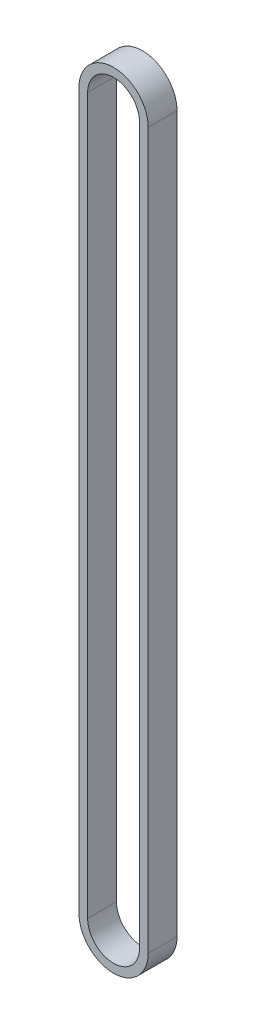
ISO-10303-21;
HEADER;
FILE_DESCRIPTION(('STEP AP214'),'2;1');
FILE_NAME('part.step','',(''),(''),'','','');
FILE_SCHEMA(('AUTOMOTIVE_DESIGN { 1 0 10303 214 1 1 1 1 }'));
ENDSEC;
DATA;
#1=APPLICATION_CONTEXT('core data for automotive mechanical design processes');
#2=APPLICATION_PROTOCOL_DEFINITION('international standard','automotive_design',2000,#1);
#3=PRODUCT_CONTEXT('',#1,'mechanical');
#4=PRODUCT('Part','Part','',(#3));
#5=PRODUCT_RELATED_PRODUCT_CATEGORY('part','',(#4));
#6=PRODUCT_DEFINITION_FORMATION('','',#4);
#7=PRODUCT_DEFINITION_CONTEXT('part definition',#1,'design');
#8=PRODUCT_DEFINITION('design','',#6,#7);
#9=PRODUCT_DEFINITION_SHAPE('','',#8);
#10=(LENGTH_UNIT() NAMED_UNIT(*) SI_UNIT(.MILLI.,.METRE.));
#11=(NAMED_UNIT(*) PLANE_ANGLE_UNIT() SI_UNIT($,.RADIAN.));
#12=(NAMED_UNIT(*) SI_UNIT($,.STERADIAN.) SOLID_ANGLE_UNIT());
#13=UNCERTAINTY_MEASURE_WITH_UNIT(LENGTH_MEASURE(1.E-05),#10,'distance_accuracy_value','');
#14=(GEOMETRIC_REPRESENTATION_CONTEXT(3) GLOBAL_UNCERTAINTY_ASSIGNED_CONTEXT((#13)) GLOBAL_UNIT_ASSIGNED_CONTEXT((#10,
#11,#12)) REPRESENTATION_CONTEXT('',''));
#15=CARTESIAN_POINT('',(0.,0.,0.));
#16=DIRECTION('',(0.,0.,1.));
#17=DIRECTION('',(1.,0.,0.));
#18=AXIS2_PLACEMENT_3D('',#15,#16,#17);
#19=CARTESIAN_POINT('',(0.,248.,10.));
#20=DIRECTION('',(0.,0.,-1.));
#21=DIRECTION('',(-1.,0.,0.));
#22=AXIS2_PLACEMENT_3D('',#19,#20,#21);
#23=CYLINDRICAL_SURFACE('',#22,9.);
#24=CARTESIAN_POINT('',(0.,248.,0.));
#25=DIRECTION('',(0.,0.,1.));
#26=DIRECTION('',(1.,0.,0.));
#27=AXIS2_PLACEMENT_3D('',#24,#25,#26);
#28=CIRCLE('',#27,9.);
#29=CARTESIAN_POINT('',(9.,248.,0.));
#30=VERTEX_POINT('',#29);
#31=CARTESIAN_POINT('',(-9.,248.,0.));
#32=VERTEX_POINT('',#31);
#33=EDGE_CURVE('E144',#30,#32,#28,.T.);
#34=ORIENTED_EDGE('',*,*,#33,.F.);
#35=DIRECTION('',(0.,0.,-1.));
#36=VECTOR('',#35,1.);
#37=CARTESIAN_POINT('',(9.,248.,10.));
#38=LINE('',#37,#36);
#39=CARTESIAN_POINT('',(9.,248.,10.));
#40=VERTEX_POINT('',#39);
#41=EDGE_CURVE('E11',#40,#30,#38,.T.);
#42=ORIENTED_EDGE('',*,*,#41,.F.);
#43=CARTESIAN_POINT('',(0.,248.,10.));
#44=DIRECTION('',(0.,0.,1.));
#45=DIRECTION('',(1.,0.,0.));
#46=AXIS2_PLACEMENT_3D('',#43,#44,#45);
#47=CIRCLE('',#46,9.);
#48=CARTESIAN_POINT('',(-9.,248.,10.));
#49=VERTEX_POINT('',#48);
#50=EDGE_CURVE('E126',#40,#49,#47,.T.);
#51=ORIENTED_EDGE('',*,*,#50,.T.);
#52=DIRECTION('',(0.,0.,-1.));
#53=VECTOR('',#52,1.);
#54=CARTESIAN_POINT('',(-9.,248.,10.));
#55=LINE('',#54,#53);
#56=EDGE_CURVE('E57',#49,#32,#55,.T.);
#57=ORIENTED_EDGE('',*,*,#56,.T.);
#58=EDGE_LOOP('',(#34,#42,#51,#57));
#59=FACE_BOUND('',#58,.T.);
#60=ADVANCED_FACE('F38',(#59),#23,.F.);
#61=CARTESIAN_POINT('',(9.,0.,10.));
#62=DIRECTION('',(-1.,0.,0.));
#63=DIRECTION('',(0.,-1.,0.));
#64=AXIS2_PLACEMENT_3D('',#61,#62,#63);
#65=PLANE('',#64);
#66=DIRECTION('',(0.,1.,0.));
#67=VECTOR('',#66,1.);
#68=CARTESIAN_POINT('',(9.,0.,0.));
#69=LINE('',#68,#67);
#70=CARTESIAN_POINT('',(9.,0.,0.));
#71=VERTEX_POINT('',#70);
#72=EDGE_CURVE('E115',#71,#30,#69,.T.);
#73=ORIENTED_EDGE('',*,*,#72,.F.);
#74=DIRECTION('',(0.,0.,-1.));
#75=VECTOR('',#74,1.);
#76=CARTESIAN_POINT('',(9.,0.,10.));
#77=LINE('',#76,#75);
#78=CARTESIAN_POINT('',(9.,0.,10.));
#79=VERTEX_POINT('',#78);
#80=EDGE_CURVE('E48',#79,#71,#77,.T.);
#81=ORIENTED_EDGE('',*,*,#80,.F.);
#82=DIRECTION('',(0.,1.,0.));
#83=VECTOR('',#82,1.);
#84=CARTESIAN_POINT('',(9.,0.,10.));
#85=LINE('',#84,#83);
#86=EDGE_CURVE('E113',#79,#40,#85,.T.);
#87=ORIENTED_EDGE('',*,*,#86,.T.);
#88=ORIENTED_EDGE('',*,*,#41,.T.);
#89=EDGE_LOOP('',(#73,#81,#87,#88));
#90=FACE_BOUND('',#89,.T.);
#91=ADVANCED_FACE('F112',(#90),#65,.T.);
#92=CARTESIAN_POINT('',(0.,0.,10.));
#93=DIRECTION('',(0.,0.,-1.));
#94=DIRECTION('',(-1.,0.,0.));
#95=AXIS2_PLACEMENT_3D('',#92,#93,#94);
#96=CYLINDRICAL_SURFACE('',#95,9.);
#97=CARTESIAN_POINT('',(0.,0.,0.));
#98=DIRECTION('',(0.,0.,1.));
#99=DIRECTION('',(1.,0.,0.));
#100=AXIS2_PLACEMENT_3D('',#97,#98,#99);
#101=CIRCLE('',#100,9.);
#102=CARTESIAN_POINT('',(-9.,0.,0.));
#103=VERTEX_POINT('',#102);
#104=EDGE_CURVE('E147',#103,#71,#101,.T.);
#105=ORIENTED_EDGE('',*,*,#104,.F.);
#106=DIRECTION('',(0.,0.,-1.));
#107=VECTOR('',#106,1.);
#108=CARTESIAN_POINT('',(-9.,0.,10.));
#109=LINE('',#108,#107);
#110=CARTESIAN_POINT('',(-9.,0.,10.));
#111=VERTEX_POINT('',#110);
#112=EDGE_CURVE('E82',#111,#103,#109,.T.);
#113=ORIENTED_EDGE('',*,*,#112,.F.);
#114=CARTESIAN_POINT('',(0.,0.,10.));
#115=DIRECTION('',(0.,0.,1.));
#116=DIRECTION('',(1.,0.,0.));
#117=AXIS2_PLACEMENT_3D('',#114,#115,#116);
#118=CIRCLE('',#117,9.);
#119=EDGE_CURVE('E125',#111,#79,#118,.T.);
#120=ORIENTED_EDGE('',*,*,#119,.T.);
#121=ORIENTED_EDGE('',*,*,#80,.T.);
#122=EDGE_LOOP('',(#105,#113,#120,#121));
#123=FACE_BOUND('',#122,.T.);
#124=ADVANCED_FACE('F128',(#123),#96,.F.);
#125=CARTESIAN_POINT('',(-12.,0.,10.));
#126=DIRECTION('',(1.,0.,0.));
#127=DIRECTION('',(0.,1.,0.));
#128=AXIS2_PLACEMENT_3D('',#125,#126,#127);
#129=PLANE('',#128);
#130=DIRECTION('',(0.,-1.,0.));
#131=VECTOR('',#130,1.);
#132=CARTESIAN_POINT('',(-12.,0.,0.));
#133=LINE('',#132,#131);
#134=CARTESIAN_POINT('',(-12.,248.,0.));
#135=VERTEX_POINT('',#134);
#136=CARTESIAN_POINT('',(-12.,0.,0.));
#137=VERTEX_POINT('',#136);
#138=EDGE_CURVE('E135',#135,#137,#133,.T.);
#139=ORIENTED_EDGE('',*,*,#138,.T.);
#140=DIRECTION('',(0.,0.,-1.));
#141=VECTOR('',#140,1.);
#142=CARTESIAN_POINT('',(-12.,0.,10.));
#143=LINE('',#142,#141);
#144=CARTESIAN_POINT('',(-12.,0.,10.));
#145=VERTEX_POINT('',#144);
#146=EDGE_CURVE('E42',#145,#137,#143,.T.);
#147=ORIENTED_EDGE('',*,*,#146,.F.);
#148=DIRECTION('',(0.,-1.,0.));
#149=VECTOR('',#148,1.);
#150=CARTESIAN_POINT('',(-12.,0.,10.));
#151=LINE('',#150,#149);
#152=CARTESIAN_POINT('',(-12.,248.,10.));
#153=VERTEX_POINT('',#152);
#154=EDGE_CURVE('E152',#153,#145,#151,.T.);
#155=ORIENTED_EDGE('',*,*,#154,.F.);
#156=DIRECTION('',(0.,0.,-1.));
#157=VECTOR('',#156,1.);
#158=CARTESIAN_POINT('',(-12.,248.,10.));
#159=LINE('',#158,#157);
#160=EDGE_CURVE('E131',#153,#135,#159,.T.);
#161=ORIENTED_EDGE('',*,*,#160,.T.);
#162=EDGE_LOOP('',(#139,#147,#155,#161));
#163=FACE_BOUND('',#162,.T.);
#164=ADVANCED_FACE('F40',(#163),#129,.F.);
#165=CARTESIAN_POINT('',(0.,0.,10.));
#166=DIRECTION('',(0.,0.,-1.));
#167=DIRECTION('',(-1.,0.,0.));
#168=AXIS2_PLACEMENT_3D('',#165,#166,#167);
#169=CYLINDRICAL_SURFACE('',#168,12.);
#170=CARTESIAN_POINT('',(0.,0.,0.));
#171=DIRECTION('',(0.,0.,1.));
#172=DIRECTION('',(1.,0.,0.));
#173=AXIS2_PLACEMENT_3D('',#170,#171,#172);
#174=CIRCLE('',#173,12.);
#175=CARTESIAN_POINT('',(12.,0.,0.));
#176=VERTEX_POINT('',#175);
#177=EDGE_CURVE('E138',#137,#176,#174,.T.);
#178=ORIENTED_EDGE('',*,*,#177,.T.);
#179=DIRECTION('',(0.,0.,-1.));
#180=VECTOR('',#179,1.);
#181=CARTESIAN_POINT('',(12.,0.,10.));
#182=LINE('',#181,#180);
#183=CARTESIAN_POINT('',(12.,0.,10.));
#184=VERTEX_POINT('',#183);
#185=EDGE_CURVE('E159',#184,#176,#182,.T.);
#186=ORIENTED_EDGE('',*,*,#185,.F.);
#187=CARTESIAN_POINT('',(0.,0.,10.));
#188=DIRECTION('',(0.,0.,1.));
#189=DIRECTION('',(1.,0.,0.));
#190=AXIS2_PLACEMENT_3D('',#187,#188,#189);
#191=CIRCLE('',#190,12.);
#192=EDGE_CURVE('E95',#145,#184,#191,.T.);
#193=ORIENTED_EDGE('',*,*,#192,.F.);
#194=ORIENTED_EDGE('',*,*,#146,.T.);
#195=EDGE_LOOP('',(#178,#186,#193,#194));
#196=FACE_BOUND('',#195,.T.);
#197=ADVANCED_FACE('F165',(#196),#169,.T.);
#198=CARTESIAN_POINT('',(12.,0.,10.));
#199=DIRECTION('',(-1.,0.,0.));
#200=DIRECTION('',(0.,-1.,0.));
#201=AXIS2_PLACEMENT_3D('',#198,#199,#200);
#202=PLANE('',#201);
#203=DIRECTION('',(0.,1.,0.));
#204=VECTOR('',#203,1.);
#205=CARTESIAN_POINT('',(12.,0.,0.));
#206=LINE('',#205,#204);
#207=CARTESIAN_POINT('',(12.,248.,0.));
#208=VERTEX_POINT('',#207);
#209=EDGE_CURVE('E140',#176,#208,#206,.T.);
#210=ORIENTED_EDGE('',*,*,#209,.T.);
#211=DIRECTION('',(0.,0.,-1.));
#212=VECTOR('',#211,1.);
#213=CARTESIAN_POINT('',(12.,248.,10.));
#214=LINE('',#213,#212);
#215=CARTESIAN_POINT('',(12.,248.,10.));
#216=VERTEX_POINT('',#215);
#217=EDGE_CURVE('E157',#216,#208,#214,.T.);
#218=ORIENTED_EDGE('',*,*,#217,.F.);
#219=DIRECTION('',(0.,1.,0.));
#220=VECTOR('',#219,1.);
#221=CARTESIAN_POINT('',(12.,0.,10.));
#222=LINE('',#221,#220);
#223=EDGE_CURVE('E181',#184,#216,#222,.T.);
#224=ORIENTED_EDGE('',*,*,#223,.F.);
#225=ORIENTED_EDGE('',*,*,#185,.T.);
#226=EDGE_LOOP('',(#210,#218,#224,#225));
#227=FACE_BOUND('',#226,.T.);
#228=ADVANCED_FACE('F175',(#227),#202,.F.);
#229=CARTESIAN_POINT('',(0.,248.,10.));
#230=DIRECTION('',(0.,0.,-1.));
#231=DIRECTION('',(-1.,0.,0.));
#232=AXIS2_PLACEMENT_3D('',#229,#230,#231);
#233=CYLINDRICAL_SURFACE('',#232,12.);
#234=CARTESIAN_POINT('',(0.,248.,0.));
#235=DIRECTION('',(0.,0.,1.));
#236=DIRECTION('',(1.,0.,0.));
#237=AXIS2_PLACEMENT_3D('',#234,#235,#236);
#238=CIRCLE('',#237,12.);
#239=EDGE_CURVE('E142',#208,#135,#238,.T.);
#240=ORIENTED_EDGE('',*,*,#239,.T.);
#241=ORIENTED_EDGE('',*,*,#160,.F.);
#242=CARTESIAN_POINT('',(0.,248.,10.));
#243=DIRECTION('',(0.,0.,1.));
#244=DIRECTION('',(1.,0.,0.));
#245=AXIS2_PLACEMENT_3D('',#242,#243,#244);
#246=CIRCLE('',#245,12.);
#247=EDGE_CURVE('E179',#216,#153,#246,.T.);
#248=ORIENTED_EDGE('',*,*,#247,.F.);
#249=ORIENTED_EDGE('',*,*,#217,.T.);
#250=EDGE_LOOP('',(#240,#241,#248,#249));
#251=FACE_BOUND('',#250,.T.);
#252=ADVANCED_FACE('F178',(#251),#233,.T.);
#253=CARTESIAN_POINT('',(-9.,0.,10.));
#254=DIRECTION('',(1.,0.,0.));
#255=DIRECTION('',(0.,1.,0.));
#256=AXIS2_PLACEMENT_3D('',#253,#254,#255);
#257=PLANE('',#256);
#258=DIRECTION('',(0.,-1.,0.));
#259=VECTOR('',#258,1.);
#260=CARTESIAN_POINT('',(-9.,0.,0.));
#261=LINE('',#260,#259);
#262=EDGE_CURVE('E149',#32,#103,#261,.T.);
#263=ORIENTED_EDGE('',*,*,#262,.F.);
#264=ORIENTED_EDGE('',*,*,#56,.F.);
#265=DIRECTION('',(0.,-1.,0.));
#266=VECTOR('',#265,1.);
#267=CARTESIAN_POINT('',(-9.,0.,10.));
#268=LINE('',#267,#266);
#269=EDGE_CURVE('E129',#49,#111,#268,.T.);
#270=ORIENTED_EDGE('',*,*,#269,.T.);
#271=ORIENTED_EDGE('',*,*,#112,.T.);
#272=EDGE_LOOP('',(#263,#264,#270,#271));
#273=FACE_BOUND('',#272,.T.);
#274=ADVANCED_FACE('F187',(#273),#257,.T.);
#275=CARTESIAN_POINT('',(0.,0.,10.));
#276=DIRECTION('',(0.,0.,1.));
#277=DIRECTION('',(1.,0.,0.));
#278=AXIS2_PLACEMENT_3D('',#275,#276,#277);
#279=PLANE('',#278);
#280=ORIENTED_EDGE('',*,*,#154,.T.);
#281=ORIENTED_EDGE('',*,*,#192,.T.);
#282=ORIENTED_EDGE('',*,*,#223,.T.);
#283=ORIENTED_EDGE('',*,*,#247,.T.);
#284=EDGE_LOOP('',(#280,#281,#282,#283));
#285=FACE_BOUND('',#284,.T.);
#286=ORIENTED_EDGE('',*,*,#50,.F.);
#287=ORIENTED_EDGE('',*,*,#86,.F.);
#288=ORIENTED_EDGE('',*,*,#119,.F.);
#289=ORIENTED_EDGE('',*,*,#269,.F.);
#290=EDGE_LOOP('',(#286,#287,#288,#289));
#291=FACE_BOUND('',#290,.T.);
#292=ADVANCED_FACE('F123',(#285,#291),#279,.T.);
#293=CARTESIAN_POINT('',(0.,0.,0.));
#294=DIRECTION('',(0.,0.,1.));
#295=DIRECTION('',(1.,0.,0.));
#296=AXIS2_PLACEMENT_3D('',#293,#294,#295);
#297=PLANE('',#296);
#298=ORIENTED_EDGE('',*,*,#138,.F.);
#299=ORIENTED_EDGE('',*,*,#239,.F.);
#300=ORIENTED_EDGE('',*,*,#209,.F.);
#301=ORIENTED_EDGE('',*,*,#177,.F.);
#302=EDGE_LOOP('',(#298,#299,#300,#301));
#303=FACE_BOUND('',#302,.T.);
#304=ORIENTED_EDGE('',*,*,#33,.T.);
#305=ORIENTED_EDGE('',*,*,#262,.T.);
#306=ORIENTED_EDGE('',*,*,#104,.T.);
#307=ORIENTED_EDGE('',*,*,#72,.T.);
#308=EDGE_LOOP('',(#304,#305,#306,#307));
#309=FACE_BOUND('',#308,.T.);
#310=ADVANCED_FACE('F172',(#303,#309),#297,.F.);
#311=CLOSED_SHELL('',(#60,#91,#124,#164,#197,#228,#252,#274,#292,#310));
#312=MANIFOLD_SOLID_BREP('B2',#311);
#313=ADVANCED_BREP_SHAPE_REPRESENTATION('',(#18,#312),#14);
#314=SHAPE_DEFINITION_REPRESENTATION(#9,#313);
ENDSEC;
END-ISO-10303-21;
